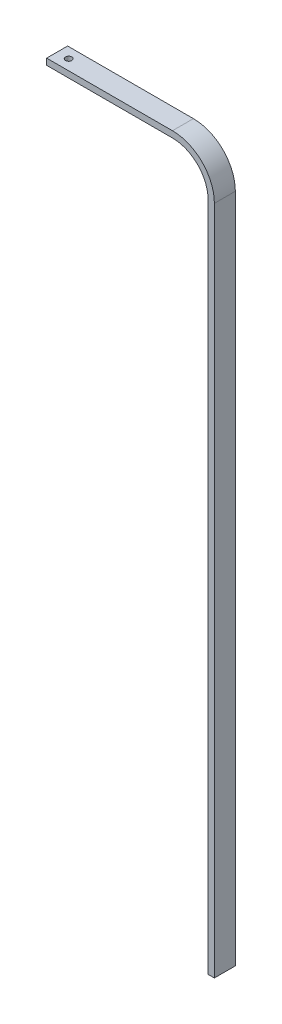
ISO-10303-21;
HEADER;
FILE_DESCRIPTION(('STEP AP214'),'2;1');
FILE_NAME('part.step','',(''),(''),'','','');
FILE_SCHEMA(('AUTOMOTIVE_DESIGN { 1 0 10303 214 1 1 1 1 }'));
ENDSEC;
DATA;
#1=APPLICATION_CONTEXT('core data for automotive mechanical design processes');
#2=APPLICATION_PROTOCOL_DEFINITION('international standard','automotive_design',2000,#1);
#3=PRODUCT_CONTEXT('',#1,'mechanical');
#4=PRODUCT('Part','Part','',(#3));
#5=PRODUCT_RELATED_PRODUCT_CATEGORY('part','',(#4));
#6=PRODUCT_DEFINITION_FORMATION('','',#4);
#7=PRODUCT_DEFINITION_CONTEXT('part definition',#1,'design');
#8=PRODUCT_DEFINITION('design','',#6,#7);
#9=PRODUCT_DEFINITION_SHAPE('','',#8);
#10=(LENGTH_UNIT() NAMED_UNIT(*) SI_UNIT(.MILLI.,.METRE.));
#11=(NAMED_UNIT(*) PLANE_ANGLE_UNIT() SI_UNIT($,.RADIAN.));
#12=(NAMED_UNIT(*) SI_UNIT($,.STERADIAN.) SOLID_ANGLE_UNIT());
#13=UNCERTAINTY_MEASURE_WITH_UNIT(LENGTH_MEASURE(1.E-05),#10,'distance_accuracy_value','');
#14=(GEOMETRIC_REPRESENTATION_CONTEXT(3) GLOBAL_UNCERTAINTY_ASSIGNED_CONTEXT((#13)) GLOBAL_UNIT_ASSIGNED_CONTEXT((#10,
#11,#12)) REPRESENTATION_CONTEXT('',''));
#15=CARTESIAN_POINT('',(0.,0.,0.));
#16=DIRECTION('',(0.,0.,1.));
#17=DIRECTION('',(1.,0.,0.));
#18=AXIS2_PLACEMENT_3D('',#15,#16,#17);
#19=CARTESIAN_POINT('',(0.,0.,10.));
#20=DIRECTION('',(0.,0.,-1.));
#21=DIRECTION('',(-1.,0.,0.));
#22=AXIS2_PLACEMENT_3D('',#19,#20,#21);
#23=CYLINDRICAL_SURFACE('',#22,20.);
#24=CARTESIAN_POINT('',(0.,0.,0.));
#25=DIRECTION('',(0.,0.,1.));
#26=DIRECTION('',(1.,0.,0.));
#27=AXIS2_PLACEMENT_3D('',#24,#25,#26);
#28=CIRCLE('',#27,20.);
#29=CARTESIAN_POINT('',(20.,0.,0.));
#30=VERTEX_POINT('',#29);
#31=CARTESIAN_POINT('',(0.,20.,0.));
#32=VERTEX_POINT('',#31);
#33=EDGE_CURVE('E141',#30,#32,#28,.T.);
#34=ORIENTED_EDGE('',*,*,#33,.T.);
#35=DIRECTION('',(0.,0.,-1.));
#36=VECTOR('',#35,1.);
#37=CARTESIAN_POINT('',(0.,20.,10.));
#38=LINE('',#37,#36);
#39=CARTESIAN_POINT('',(0.,20.,10.));
#40=VERTEX_POINT('',#39);
#41=EDGE_CURVE('E11',#40,#32,#38,.T.);
#42=ORIENTED_EDGE('',*,*,#41,.F.);
#43=CARTESIAN_POINT('',(0.,0.,10.));
#44=DIRECTION('',(0.,0.,1.));
#45=DIRECTION('',(1.,0.,0.));
#46=AXIS2_PLACEMENT_3D('',#43,#44,#45);
#47=CIRCLE('',#46,20.);
#48=CARTESIAN_POINT('',(20.,0.,10.));
#49=VERTEX_POINT('',#48);
#50=EDGE_CURVE('E163',#49,#40,#47,.T.);
#51=ORIENTED_EDGE('',*,*,#50,.F.);
#52=DIRECTION('',(0.,0.,-1.));
#53=VECTOR('',#52,1.);
#54=CARTESIAN_POINT('',(20.,0.,10.));
#55=LINE('',#54,#53);
#56=EDGE_CURVE('E137',#49,#30,#55,.T.);
#57=ORIENTED_EDGE('',*,*,#56,.T.);
#58=EDGE_LOOP('',(#34,#42,#51,#57));
#59=FACE_BOUND('',#58,.T.);
#60=ADVANCED_FACE('F39',(#59),#23,.T.);
#61=CARTESIAN_POINT('',(-60.,20.0000000000001,10.));
#62=DIRECTION('',(0.,-1.,0.));
#63=DIRECTION('',(1.,0.,0.));
#64=AXIS2_PLACEMENT_3D('',#61,#62,#63);
#65=PLANE('',#64);
#66=CARTESIAN_POINT('',(-54.5,20.,5.));
#67=DIRECTION('',(0.,1.,0.));
#68=DIRECTION('',(-1.,0.,0.));
#69=AXIS2_PLACEMENT_3D('',#66,#67,#68);
#70=CIRCLE('',#69,1.5);
#71=CARTESIAN_POINT('',(-56.,20.,5.));
#72=VERTEX_POINT('',#71);
#73=EDGE_CURVE('E208',#72,#72,#70,.T.);
#74=ORIENTED_EDGE('',*,*,#73,.F.);
#75=EDGE_LOOP('',(#74));
#76=FACE_BOUND('',#75,.T.);
#77=DIRECTION('',(-1.,0.,0.));
#78=VECTOR('',#77,1.);
#79=CARTESIAN_POINT('',(-60.,20.0000000000001,0.));
#80=LINE('',#79,#78);
#81=CARTESIAN_POINT('',(-60.,20.0000000000001,0.));
#82=VERTEX_POINT('',#81);
#83=EDGE_CURVE('E145',#32,#82,#80,.T.);
#84=ORIENTED_EDGE('',*,*,#83,.T.);
#85=DIRECTION('',(0.,0.,-1.));
#86=VECTOR('',#85,1.);
#87=CARTESIAN_POINT('',(-60.,20.0000000000001,10.));
#88=LINE('',#87,#86);
#89=CARTESIAN_POINT('',(-60.,20.0000000000001,10.));
#90=VERTEX_POINT('',#89);
#91=EDGE_CURVE('E49',#90,#82,#88,.T.);
#92=ORIENTED_EDGE('',*,*,#91,.F.);
#93=DIRECTION('',(-1.,0.,0.));
#94=VECTOR('',#93,1.);
#95=CARTESIAN_POINT('',(-60.,20.0000000000001,10.));
#96=LINE('',#95,#94);
#97=EDGE_CURVE('E100',#40,#90,#96,.T.);
#98=ORIENTED_EDGE('',*,*,#97,.F.);
#99=ORIENTED_EDGE('',*,*,#41,.T.);
#100=EDGE_LOOP('',(#84,#92,#98,#99));
#101=FACE_BOUND('',#100,.T.);
#102=ADVANCED_FACE('F227',(#76,#101),#65,.F.);
#103=CARTESIAN_POINT('',(-60.,20.0000000000001,10.));
#104=DIRECTION('',(1.,0.,0.));
#105=DIRECTION('',(0.,0.,-1.));
#106=AXIS2_PLACEMENT_3D('',#103,#104,#105);
#107=PLANE('',#106);
#108=DIRECTION('',(0.,-1.,0.));
#109=VECTOR('',#108,1.);
#110=CARTESIAN_POINT('',(-60.,20.0000000000001,0.));
#111=LINE('',#110,#109);
#112=CARTESIAN_POINT('',(-60.,17.,0.));
#113=VERTEX_POINT('',#112);
#114=EDGE_CURVE('E148',#82,#113,#111,.T.);
#115=ORIENTED_EDGE('',*,*,#114,.T.);
#116=DIRECTION('',(0.,0.,-1.));
#117=VECTOR('',#116,1.);
#118=CARTESIAN_POINT('',(-60.,17.,10.));
#119=LINE('',#118,#117);
#120=CARTESIAN_POINT('',(-60.,17.,10.));
#121=VERTEX_POINT('',#120);
#122=EDGE_CURVE('E174',#121,#113,#119,.T.);
#123=ORIENTED_EDGE('',*,*,#122,.F.);
#124=DIRECTION('',(0.,-1.,0.));
#125=VECTOR('',#124,1.);
#126=CARTESIAN_POINT('',(-60.,20.0000000000001,10.));
#127=LINE('',#126,#125);
#128=EDGE_CURVE('E185',#90,#121,#127,.T.);
#129=ORIENTED_EDGE('',*,*,#128,.F.);
#130=ORIENTED_EDGE('',*,*,#91,.T.);
#131=EDGE_LOOP('',(#115,#123,#129,#130));
#132=FACE_BOUND('',#131,.T.);
#133=ADVANCED_FACE('F183',(#132),#107,.F.);
#134=CARTESIAN_POINT('',(-60.,17.,10.));
#135=DIRECTION('',(0.,1.,0.));
#136=DIRECTION('',(0.,0.,1.));
#137=AXIS2_PLACEMENT_3D('',#134,#135,#136);
#138=PLANE('',#137);
#139=CARTESIAN_POINT('',(-54.5,17.,5.));
#140=DIRECTION('',(0.,1.,0.));
#141=DIRECTION('',(0.,0.,1.));
#142=AXIS2_PLACEMENT_3D('',#139,#140,#141);
#143=CIRCLE('',#142,1.5);
#144=CARTESIAN_POINT('',(-54.5,17.,6.5));
#145=VERTEX_POINT('',#144);
#146=EDGE_CURVE('E42',#145,#145,#143,.T.);
#147=ORIENTED_EDGE('',*,*,#146,.T.);
#148=EDGE_LOOP('',(#147));
#149=FACE_BOUND('',#148,.T.);
#150=DIRECTION('',(1.,0.,0.));
#151=VECTOR('',#150,1.);
#152=CARTESIAN_POINT('',(-60.,17.,0.));
#153=LINE('',#152,#151);
#154=CARTESIAN_POINT('',(0.,17.,0.));
#155=VERTEX_POINT('',#154);
#156=EDGE_CURVE('E151',#113,#155,#153,.T.);
#157=ORIENTED_EDGE('',*,*,#156,.T.);
#158=DIRECTION('',(0.,0.,-1.));
#159=VECTOR('',#158,1.);
#160=CARTESIAN_POINT('',(0.,17.,10.));
#161=LINE('',#160,#159);
#162=CARTESIAN_POINT('',(0.,17.,10.));
#163=VERTEX_POINT('',#162);
#164=EDGE_CURVE('E170',#163,#155,#161,.T.);
#165=ORIENTED_EDGE('',*,*,#164,.F.);
#166=DIRECTION('',(1.,0.,0.));
#167=VECTOR('',#166,1.);
#168=CARTESIAN_POINT('',(-60.,17.,10.));
#169=LINE('',#168,#167);
#170=EDGE_CURVE('E198',#121,#163,#169,.T.);
#171=ORIENTED_EDGE('',*,*,#170,.F.);
#172=ORIENTED_EDGE('',*,*,#122,.T.);
#173=EDGE_LOOP('',(#157,#165,#171,#172));
#174=FACE_BOUND('',#173,.T.);
#175=ADVANCED_FACE('F193',(#149,#174),#138,.F.);
#176=CARTESIAN_POINT('',(0.,0.,10.));
#177=DIRECTION('',(0.,0.,-1.));
#178=DIRECTION('',(-1.,0.,0.));
#179=AXIS2_PLACEMENT_3D('',#176,#177,#178);
#180=CYLINDRICAL_SURFACE('',#179,17.);
#181=CARTESIAN_POINT('',(0.,0.,0.));
#182=DIRECTION('',(0.,0.,-1.));
#183=DIRECTION('',(1.,0.,0.));
#184=AXIS2_PLACEMENT_3D('',#181,#182,#183);
#185=CIRCLE('',#184,17.);
#186=CARTESIAN_POINT('',(17.,0.,0.));
#187=VERTEX_POINT('',#186);
#188=EDGE_CURVE('E154',#155,#187,#185,.T.);
#189=ORIENTED_EDGE('',*,*,#188,.T.);
#190=DIRECTION('',(0.,0.,-1.));
#191=VECTOR('',#190,1.);
#192=CARTESIAN_POINT('',(17.,0.,10.));
#193=LINE('',#192,#191);
#194=CARTESIAN_POINT('',(17.,0.,10.));
#195=VERTEX_POINT('',#194);
#196=EDGE_CURVE('E130',#195,#187,#193,.T.);
#197=ORIENTED_EDGE('',*,*,#196,.F.);
#198=CARTESIAN_POINT('',(0.,0.,10.));
#199=DIRECTION('',(0.,0.,-1.));
#200=DIRECTION('',(1.,0.,0.));
#201=AXIS2_PLACEMENT_3D('',#198,#199,#200);
#202=CIRCLE('',#201,17.);
#203=EDGE_CURVE('E119',#163,#195,#202,.T.);
#204=ORIENTED_EDGE('',*,*,#203,.F.);
#205=ORIENTED_EDGE('',*,*,#164,.T.);
#206=EDGE_LOOP('',(#189,#197,#204,#205));
#207=FACE_BOUND('',#206,.T.);
#208=ADVANCED_FACE('F196',(#207),#180,.F.);
#209=CARTESIAN_POINT('',(17.,0.,10.));
#210=DIRECTION('',(1.,0.,0.));
#211=DIRECTION('',(0.,0.,-1.));
#212=AXIS2_PLACEMENT_3D('',#209,#210,#211);
#213=PLANE('',#212);
#214=DIRECTION('',(0.,-1.,0.));
#215=VECTOR('',#214,1.);
#216=CARTESIAN_POINT('',(17.,0.,0.));
#217=LINE('',#216,#215);
#218=CARTESIAN_POINT('',(17.,-320.,0.));
#219=VERTEX_POINT('',#218);
#220=EDGE_CURVE('E128',#187,#219,#217,.T.);
#221=ORIENTED_EDGE('',*,*,#220,.T.);
#222=DIRECTION('',(0.,0.,-1.));
#223=VECTOR('',#222,1.);
#224=CARTESIAN_POINT('',(17.,-320.,10.));
#225=LINE('',#224,#223);
#226=CARTESIAN_POINT('',(17.,-320.,10.));
#227=VERTEX_POINT('',#226);
#228=EDGE_CURVE('E125',#227,#219,#225,.T.);
#229=ORIENTED_EDGE('',*,*,#228,.F.);
#230=DIRECTION('',(0.,-1.,0.));
#231=VECTOR('',#230,1.);
#232=CARTESIAN_POINT('',(17.,0.,10.));
#233=LINE('',#232,#231);
#234=EDGE_CURVE('E113',#195,#227,#233,.T.);
#235=ORIENTED_EDGE('',*,*,#234,.F.);
#236=ORIENTED_EDGE('',*,*,#196,.T.);
#237=EDGE_LOOP('',(#221,#229,#235,#236));
#238=FACE_BOUND('',#237,.T.);
#239=ADVANCED_FACE('F126',(#238),#213,.F.);
#240=CARTESIAN_POINT('',(19.9999999999987,-320.,10.));
#241=DIRECTION('',(0.,1.,0.));
#242=DIRECTION('',(-1.,0.,0.));
#243=AXIS2_PLACEMENT_3D('',#240,#241,#242);
#244=PLANE('',#243);
#245=DIRECTION('',(1.,0.,0.));
#246=VECTOR('',#245,1.);
#247=CARTESIAN_POINT('',(19.9999999999987,-320.,0.));
#248=LINE('',#247,#246);
#249=CARTESIAN_POINT('',(19.9999999999987,-320.,0.));
#250=VERTEX_POINT('',#249);
#251=EDGE_CURVE('E86',#219,#250,#248,.T.);
#252=ORIENTED_EDGE('',*,*,#251,.T.);
#253=DIRECTION('',(0.,0.,-1.));
#254=VECTOR('',#253,1.);
#255=CARTESIAN_POINT('',(19.9999999999987,-320.,10.));
#256=LINE('',#255,#254);
#257=CARTESIAN_POINT('',(19.9999999999987,-320.,10.));
#258=VERTEX_POINT('',#257);
#259=EDGE_CURVE('E131',#258,#250,#256,.T.);
#260=ORIENTED_EDGE('',*,*,#259,.F.);
#261=DIRECTION('',(1.,0.,0.));
#262=VECTOR('',#261,1.);
#263=CARTESIAN_POINT('',(19.9999999999987,-320.,10.));
#264=LINE('',#263,#262);
#265=EDGE_CURVE('E117',#227,#258,#264,.T.);
#266=ORIENTED_EDGE('',*,*,#265,.F.);
#267=ORIENTED_EDGE('',*,*,#228,.T.);
#268=EDGE_LOOP('',(#252,#260,#266,#267));
#269=FACE_BOUND('',#268,.T.);
#270=ADVANCED_FACE('F133',(#269),#244,.F.);
#271=CARTESIAN_POINT('',(20.,0.,10.));
#272=DIRECTION('',(-1.,0.,0.));
#273=DIRECTION('',(0.,-1.,0.));
#274=AXIS2_PLACEMENT_3D('',#271,#272,#273);
#275=PLANE('',#274);
#276=DIRECTION('',(0.,1.,0.));
#277=VECTOR('',#276,1.);
#278=CARTESIAN_POINT('',(20.,0.,0.));
#279=LINE('',#278,#277);
#280=EDGE_CURVE('E92',#250,#30,#279,.T.);
#281=ORIENTED_EDGE('',*,*,#280,.T.);
#282=ORIENTED_EDGE('',*,*,#56,.F.);
#283=DIRECTION('',(0.,1.,0.));
#284=VECTOR('',#283,1.);
#285=CARTESIAN_POINT('',(20.,0.,10.));
#286=LINE('',#285,#284);
#287=EDGE_CURVE('E57',#258,#49,#286,.T.);
#288=ORIENTED_EDGE('',*,*,#287,.F.);
#289=ORIENTED_EDGE('',*,*,#259,.T.);
#290=EDGE_LOOP('',(#281,#282,#288,#289));
#291=FACE_BOUND('',#290,.T.);
#292=ADVANCED_FACE('F235',(#291),#275,.F.);
#293=CARTESIAN_POINT('',(0.,0.,10.));
#294=DIRECTION('',(0.,0.,1.));
#295=DIRECTION('',(1.,0.,0.));
#296=AXIS2_PLACEMENT_3D('',#293,#294,#295);
#297=PLANE('',#296);
#298=ORIENTED_EDGE('',*,*,#50,.T.);
#299=ORIENTED_EDGE('',*,*,#97,.T.);
#300=ORIENTED_EDGE('',*,*,#128,.T.);
#301=ORIENTED_EDGE('',*,*,#170,.T.);
#302=ORIENTED_EDGE('',*,*,#203,.T.);
#303=ORIENTED_EDGE('',*,*,#234,.T.);
#304=ORIENTED_EDGE('',*,*,#265,.T.);
#305=ORIENTED_EDGE('',*,*,#287,.T.);
#306=EDGE_LOOP('',(#298,#299,#300,#301,#302,#303,#304,#305));
#307=FACE_BOUND('',#306,.T.);
#308=ADVANCED_FACE('F115',(#307),#297,.T.);
#309=CARTESIAN_POINT('',(0.,0.,0.));
#310=DIRECTION('',(0.,0.,1.));
#311=DIRECTION('',(1.,0.,0.));
#312=AXIS2_PLACEMENT_3D('',#309,#310,#311);
#313=PLANE('',#312);
#314=ORIENTED_EDGE('',*,*,#33,.F.);
#315=ORIENTED_EDGE('',*,*,#280,.F.);
#316=ORIENTED_EDGE('',*,*,#251,.F.);
#317=ORIENTED_EDGE('',*,*,#220,.F.);
#318=ORIENTED_EDGE('',*,*,#188,.F.);
#319=ORIENTED_EDGE('',*,*,#156,.F.);
#320=ORIENTED_EDGE('',*,*,#114,.F.);
#321=ORIENTED_EDGE('',*,*,#83,.F.);
#322=EDGE_LOOP('',(#314,#315,#316,#317,#318,#319,#320,#321));
#323=FACE_BOUND('',#322,.T.);
#324=ADVANCED_FACE('F189',(#323),#313,.F.);
#325=CARTESIAN_POINT('',(-54.5,15.,5.));
#326=DIRECTION('',(0.,1.,0.));
#327=DIRECTION('',(-1.,0.,0.));
#328=AXIS2_PLACEMENT_3D('',#325,#326,#327);
#329=CYLINDRICAL_SURFACE('',#328,1.5);
#330=ORIENTED_EDGE('',*,*,#73,.T.);
#331=EDGE_LOOP('',(#330));
#332=FACE_BOUND('',#331,.T.);
#333=ORIENTED_EDGE('',*,*,#146,.F.);
#334=EDGE_LOOP('',(#333));
#335=FACE_BOUND('',#334,.T.);
#336=ADVANCED_FACE('F218',(#332,#335),#329,.F.);
#337=CLOSED_SHELL('',(#60,#102,#133,#175,#208,#239,#270,#292,#308,#324,#336));
#338=MANIFOLD_SOLID_BREP('B2',#337);
#339=ADVANCED_BREP_SHAPE_REPRESENTATION('',(#18,#338),#14);
#340=SHAPE_DEFINITION_REPRESENTATION(#9,#339);
ENDSEC;
END-ISO-10303-21;
